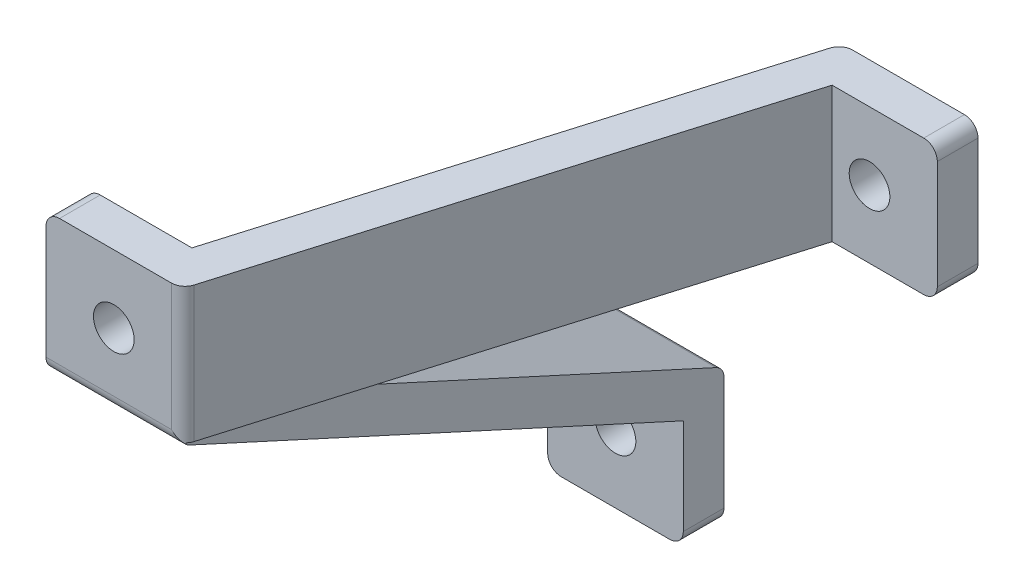
ISO-10303-21;
HEADER;
FILE_DESCRIPTION(('STEP AP214'),'2;1');
FILE_NAME('part.step','',(''),(''),'','','');
FILE_SCHEMA(('AUTOMOTIVE_DESIGN { 1 0 10303 214 1 1 1 1 }'));
ENDSEC;
DATA;
#1=APPLICATION_CONTEXT('core data for automotive mechanical design processes');
#2=APPLICATION_PROTOCOL_DEFINITION('international standard','automotive_design',2000,#1);
#3=PRODUCT_CONTEXT('',#1,'mechanical');
#4=PRODUCT('Part','Part','',(#3));
#5=PRODUCT_RELATED_PRODUCT_CATEGORY('part','',(#4));
#6=PRODUCT_DEFINITION_FORMATION('','',#4);
#7=PRODUCT_DEFINITION_CONTEXT('part definition',#1,'design');
#8=PRODUCT_DEFINITION('design','',#6,#7);
#9=PRODUCT_DEFINITION_SHAPE('','',#8);
#10=(LENGTH_UNIT() NAMED_UNIT(*) SI_UNIT(.MILLI.,.METRE.));
#11=(NAMED_UNIT(*) PLANE_ANGLE_UNIT() SI_UNIT($,.RADIAN.));
#12=(NAMED_UNIT(*) SI_UNIT($,.STERADIAN.) SOLID_ANGLE_UNIT());
#13=UNCERTAINTY_MEASURE_WITH_UNIT(LENGTH_MEASURE(1.E-05),#10,'distance_accuracy_value','');
#14=(GEOMETRIC_REPRESENTATION_CONTEXT(3) GLOBAL_UNCERTAINTY_ASSIGNED_CONTEXT((#13)) GLOBAL_UNIT_ASSIGNED_CONTEXT((#10,
#11,#12)) REPRESENTATION_CONTEXT('',''));
#15=CARTESIAN_POINT('',(0.,0.,0.));
#16=DIRECTION('',(0.,0.,1.));
#17=DIRECTION('',(1.,0.,0.));
#18=AXIS2_PLACEMENT_3D('',#15,#16,#17);
#19=CARTESIAN_POINT('',(-109.281112265453,-13.7331029199973,3.));
#20=DIRECTION('',(0.,-1.,0.));
#21=DIRECTION('',(-1.,0.,0.));
#22=AXIS2_PLACEMENT_3D('',#19,#20,#21);
#23=PLANE('',#22);
#24=DIRECTION('',(1.,0.,0.));
#25=VECTOR('',#24,1.);
#26=CARTESIAN_POINT('',(-109.281112265453,-13.7331029199973,0.));
#27=LINE('',#26,#25);
#28=CARTESIAN_POINT('',(-35.1593378215953,-13.7331029199973,0.));
#29=VERTEX_POINT('',#28);
#30=CARTESIAN_POINT('',(-26.9057977687508,-13.7331029199973,0.));
#31=VERTEX_POINT('',#30);
#32=EDGE_CURVE('E340',#29,#31,#27,.T.);
#33=ORIENTED_EDGE('',*,*,#32,.T.);
#34=DIRECTION('',(0.,0.,-1.));
#35=VECTOR('',#34,1.);
#36=CARTESIAN_POINT('',(-26.9057977687508,-13.7331029199973,3.));
#37=LINE('',#36,#35);
#38=CARTESIAN_POINT('',(-26.9057977687508,-13.7331029199973,3.));
#39=VERTEX_POINT('',#38);
#40=EDGE_CURVE('E355',#39,#31,#37,.T.);
#41=ORIENTED_EDGE('',*,*,#40,.F.);
#42=DIRECTION('',(1.,0.,0.));
#43=VECTOR('',#42,1.);
#44=CARTESIAN_POINT('',(-109.281112265453,-13.7331029199973,3.));
#45=LINE('',#44,#43);
#46=CARTESIAN_POINT('',(-33.6664179272841,-13.7331029199973,3.));
#47=VERTEX_POINT('',#46);
#48=EDGE_CURVE('E325',#47,#39,#45,.T.);
#49=ORIENTED_EDGE('',*,*,#48,.F.);
#50=DIRECTION('',(0.284354514419535,0.,-0.958719202962593));
#51=VECTOR('',#50,1.);
#52=CARTESIAN_POINT('',(-38.9625839085446,-13.7331029199973,20.8563580700542));
#53=LINE('',#52,#51);
#54=CARTESIAN_POINT('',(-44.4282968769192,-13.7331029199973,39.2843545144195));
#55=VERTEX_POINT('',#54);
#56=EDGE_CURVE('E302',#55,#47,#53,.T.);
#57=ORIENTED_EDGE('',*,*,#56,.F.);
#58=CARTESIAN_POINT('',(-45.3870160798818,-13.7331029199973,39.));
#59=DIRECTION('',(0.,1.,0.));
#60=DIRECTION('',(-1.,0.,0.));
#61=AXIS2_PLACEMENT_3D('',#58,#59,#60);
#62=CIRCLE('',#61,1.);
#63=CARTESIAN_POINT('',(-44.6405561327263,-13.7331029199973,39.6654303474388));
#64=VERTEX_POINT('',#63);
#65=EDGE_CURVE('E359',#64,#55,#62,.T.);
#66=ORIENTED_EDGE('',*,*,#65,.F.);
#67=DIRECTION('',(0.,0.,1.));
#68=VECTOR('',#67,1.);
#69=CARTESIAN_POINT('',(-44.6405561327263,-13.7331029199973,0.));
#70=LINE('',#69,#68);
#71=CARTESIAN_POINT('',(-44.6405561327263,-13.7331029199973,32.7886351030573));
#72=VERTEX_POINT('',#71);
#73=EDGE_CURVE('E306',#72,#64,#70,.T.);
#74=ORIENTED_EDGE('',*,*,#73,.F.);
#75=DIRECTION('',(1.,0.,0.));
#76=VECTOR('',#75,1.);
#77=CARTESIAN_POINT('',(-109.281112265452,-13.7331029199973,32.7886351030575));
#78=LINE('',#77,#76);
#79=CARTESIAN_POINT('',(-46.5505225814085,-13.7331029199973,32.7886351030573));
#80=VERTEX_POINT('',#79);
#81=EDGE_CURVE('E271',#80,#72,#78,.T.);
#82=ORIENTED_EDGE('',*,*,#81,.F.);
#83=CARTESIAN_POINT('',(-45.960950861435,-13.7331029199973,30.3848468040764));
#84=DIRECTION('',(0.,1.,0.));
#85=DIRECTION('',(0.284354514419536,0.,-0.958719202962593));
#86=AXIS2_PLACEMENT_3D('',#83,#84,#85);
#87=ELLIPSE('',#86,2.48968652663901,1.);
#88=CARTESIAN_POINT('',(-45.0022316584724,-13.7331029199973,30.6692013184959));
#89=VERTEX_POINT('',#88);
#90=EDGE_CURVE('E11',#89,#80,#87,.F.);
#91=ORIENTED_EDGE('',*,*,#90,.F.);
#92=DIRECTION('',(-0.284354514419535,0.,0.958719202962593));
#93=VECTOR('',#92,1.);
#94=CARTESIAN_POINT('',(-41.8387415174324,-13.7331029199973,20.0032945267956));
#95=LINE('',#94,#93);
#96=CARTESIAN_POINT('',(-36.1180570245578,-13.7331029199973,0.715645485580462));
#97=VERTEX_POINT('',#96);
#98=EDGE_CURVE('E297',#97,#89,#95,.T.);
#99=ORIENTED_EDGE('',*,*,#98,.F.);
#100=CARTESIAN_POINT('',(-35.1593378215953,-13.7331029199973,1.));
#101=DIRECTION('',(0.,1.,0.));
#102=DIRECTION('',(-1.,0.,0.));
#103=AXIS2_PLACEMENT_3D('',#100,#101,#102);
#104=CIRCLE('',#103,1.);
#105=EDGE_CURVE('E363',#29,#97,#104,.T.);
#106=ORIENTED_EDGE('',*,*,#105,.F.);
#107=EDGE_LOOP('',(#33,#41,#49,#57,#66,#74,#82,#91,#99,#106));
#108=FACE_BOUND('',#107,.T.);
#109=ADVANCED_FACE('F49',(#108),#23,.T.);
#110=CARTESIAN_POINT('',(-41.8387415174323,-55.8590694866648,20.0032945267957));
#111=DIRECTION('',(0.958719202962593,0.,0.284354514419535));
#112=DIRECTION('',(-0.284354514419535,0.,0.958719202962593));
#113=AXIS2_PLACEMENT_3D('',#110,#111,#112);
#114=PLANE('',#113);
#115=ORIENTED_EDGE('',*,*,#98,.T.);
#116=DIRECTION('',(-0.260409073095521,0.401656991472723,0.877985635332727));
#117=VECTOR('',#116,1.);
#118=CARTESIAN_POINT('',(-45.5294378749046,-12.9199359275393,32.4467103713997));
#119=LINE('',#118,#117);
#120=CARTESIAN_POINT('',(-46.8799359741929,-10.8369170945097,37.));
#121=VERTEX_POINT('',#120);
#122=EDGE_CURVE('E367',#121,#89,#119,.F.);
#123=ORIENTED_EDGE('',*,*,#122,.F.);
#124=DIRECTION('',(0.,1.,0.));
#125=VECTOR('',#124,1.);
#126=CARTESIAN_POINT('',(-46.8799359741928,-55.8590694866648,37.));
#127=LINE('',#126,#125);
#128=CARTESIAN_POINT('',(-46.8799359741929,-3.73310291999734,37.));
#129=VERTEX_POINT('',#128);
#130=EDGE_CURVE('E296',#121,#129,#127,.T.);
#131=ORIENTED_EDGE('',*,*,#130,.T.);
#132=DIRECTION('',(-0.284354514419535,0.,0.958719202962593));
#133=VECTOR('',#132,1.);
#134=CARTESIAN_POINT('',(-41.8387415174324,-3.73310291999733,20.0032945267957));
#135=LINE('',#134,#133);
#136=CARTESIAN_POINT('',(-36.1180570245578,-3.73310291999731,0.715645485580462));
#137=VERTEX_POINT('',#136);
#138=EDGE_CURVE('E292',#137,#129,#135,.T.);
#139=ORIENTED_EDGE('',*,*,#138,.F.);
#140=DIRECTION('',(0.,-1.,0.));
#141=VECTOR('',#140,1.);
#142=CARTESIAN_POINT('',(-36.1180570245577,-55.8590694866647,0.715645485580462));
#143=LINE('',#142,#141);
#144=EDGE_CURVE('E370',#97,#137,#143,.F.);
#145=ORIENTED_EDGE('',*,*,#144,.F.);
#146=EDGE_LOOP('',(#115,#123,#131,#139,#145));
#147=FACE_BOUND('',#146,.T.);
#148=ADVANCED_FACE('F506',(#147),#114,.F.);
#149=CARTESIAN_POINT('',(-109.281112265453,0.,3.));
#150=DIRECTION('',(0.,0.,1.));
#151=DIRECTION('',(-1.,0.,0.));
#152=AXIS2_PLACEMENT_3D('',#149,#150,#151);
#153=PLANE('',#152);
#154=CARTESIAN_POINT('',(-30.9057977687508,-8.73310291999731,3.));
#155=DIRECTION('',(0.,0.,-1.));
#156=DIRECTION('',(-1.,0.,0.));
#157=AXIS2_PLACEMENT_3D('',#154,#155,#156);
#158=CIRCLE('',#157,1.5);
#159=CARTESIAN_POINT('',(-32.4057977687508,-8.73310291999731,3.));
#160=VERTEX_POINT('',#159);
#161=EDGE_CURVE('E316',#160,#160,#158,.T.);
#162=ORIENTED_EDGE('',*,*,#161,.T.);
#163=EDGE_LOOP('',(#162));
#164=FACE_BOUND('',#163,.T.);
#165=DIRECTION('',(-1.,0.,0.));
#166=VECTOR('',#165,1.);
#167=CARTESIAN_POINT('',(-109.281112265453,-3.73310291999749,3.));
#168=LINE('',#167,#166);
#169=CARTESIAN_POINT('',(-26.9057977687508,-3.73310291999729,3.));
#170=VERTEX_POINT('',#169);
#171=CARTESIAN_POINT('',(-33.6664179272842,-3.73310291999731,3.));
#172=VERTEX_POINT('',#171);
#173=EDGE_CURVE('E329',#170,#172,#168,.T.);
#174=ORIENTED_EDGE('',*,*,#173,.T.);
#175=DIRECTION('',(0.,1.,0.));
#176=VECTOR('',#175,1.);
#177=CARTESIAN_POINT('',(-33.666417927284,-55.8590694866647,3.));
#178=LINE('',#177,#176);
#179=EDGE_CURVE('E291',#47,#172,#178,.T.);
#180=ORIENTED_EDGE('',*,*,#179,.F.);
#181=ORIENTED_EDGE('',*,*,#48,.T.);
#182=CARTESIAN_POINT('',(-26.9057977687508,-12.7331029199973,3.));
#183=DIRECTION('',(0.,0.,-1.));
#184=DIRECTION('',(-1.,0.,0.));
#185=AXIS2_PLACEMENT_3D('',#182,#183,#184);
#186=CIRCLE('',#185,1.);
#187=CARTESIAN_POINT('',(-25.9057977687508,-12.7331029199973,3.));
#188=VERTEX_POINT('',#187);
#189=EDGE_CURVE('E470',#188,#39,#186,.T.);
#190=ORIENTED_EDGE('',*,*,#189,.F.);
#191=DIRECTION('',(0.,1.,0.));
#192=VECTOR('',#191,1.);
#193=CARTESIAN_POINT('',(-25.9057977687508,0.,3.));
#194=LINE('',#193,#192);
#195=CARTESIAN_POINT('',(-25.9057977687508,-4.73310291999729,3.));
#196=VERTEX_POINT('',#195);
#197=EDGE_CURVE('E320',#188,#196,#194,.T.);
#198=ORIENTED_EDGE('',*,*,#197,.T.);
#199=CARTESIAN_POINT('',(-26.9057977687508,-4.73310291999729,3.));
#200=DIRECTION('',(0.,0.,-1.));
#201=DIRECTION('',(-1.,0.,0.));
#202=AXIS2_PLACEMENT_3D('',#199,#200,#201);
#203=CIRCLE('',#202,1.);
#204=EDGE_CURVE('E59',#170,#196,#203,.T.);
#205=ORIENTED_EDGE('',*,*,#204,.F.);
#206=EDGE_LOOP('',(#174,#180,#181,#190,#198,#205));
#207=FACE_BOUND('',#206,.T.);
#208=ADVANCED_FACE('F481',(#164,#207),#153,.T.);
#209=CARTESIAN_POINT('',(-25.9057977687508,0.,3.));
#210=DIRECTION('',(1.,0.,0.));
#211=DIRECTION('',(0.,0.,1.));
#212=AXIS2_PLACEMENT_3D('',#209,#210,#211);
#213=PLANE('',#212);
#214=ORIENTED_EDGE('',*,*,#197,.F.);
#215=DIRECTION('',(0.,0.,-1.));
#216=VECTOR('',#215,1.);
#217=CARTESIAN_POINT('',(-25.9057977687508,-12.7331029199973,3.));
#218=LINE('',#217,#216);
#219=CARTESIAN_POINT('',(-25.9057977687508,-12.7331029199973,0.));
#220=VERTEX_POINT('',#219);
#221=EDGE_CURVE('E74',#220,#188,#218,.F.);
#222=ORIENTED_EDGE('',*,*,#221,.F.);
#223=DIRECTION('',(0.,1.,0.));
#224=VECTOR('',#223,1.);
#225=CARTESIAN_POINT('',(-25.9057977687508,0.,0.));
#226=LINE('',#225,#224);
#227=CARTESIAN_POINT('',(-25.9057977687508,-4.73310291999729,0.));
#228=VERTEX_POINT('',#227);
#229=EDGE_CURVE('E337',#220,#228,#226,.T.);
#230=ORIENTED_EDGE('',*,*,#229,.T.);
#231=DIRECTION('',(0.,0.,-1.));
#232=VECTOR('',#231,1.);
#233=CARTESIAN_POINT('',(-25.9057977687508,-4.73310291999729,3.));
#234=LINE('',#233,#232);
#235=EDGE_CURVE('E66',#196,#228,#234,.T.);
#236=ORIENTED_EDGE('',*,*,#235,.F.);
#237=EDGE_LOOP('',(#214,#222,#230,#236));
#238=FACE_BOUND('',#237,.T.);
#239=ADVANCED_FACE('F482',(#238),#213,.T.);
#240=CARTESIAN_POINT('',(-30.9057977687508,-8.73310291999731,3.));
#241=DIRECTION('',(0.,0.,-1.));
#242=DIRECTION('',(1.,0.,0.));
#243=AXIS2_PLACEMENT_3D('',#240,#241,#242);
#244=CYLINDRICAL_SURFACE('',#243,1.5);
#245=ORIENTED_EDGE('',*,*,#161,.F.);
#246=EDGE_LOOP('',(#245));
#247=FACE_BOUND('',#246,.T.);
#248=CARTESIAN_POINT('',(-30.9057977687508,-8.73310291999731,0.));
#249=DIRECTION('',(0.,0.,-1.));
#250=DIRECTION('',(-1.,0.,0.));
#251=AXIS2_PLACEMENT_3D('',#248,#249,#250);
#252=CIRCLE('',#251,1.5);
#253=CARTESIAN_POINT('',(-32.4057977687508,-8.73310291999731,0.));
#254=VERTEX_POINT('',#253);
#255=EDGE_CURVE('E301',#254,#254,#252,.T.);
#256=ORIENTED_EDGE('',*,*,#255,.T.);
#257=EDGE_LOOP('',(#256));
#258=FACE_BOUND('',#257,.T.);
#259=ADVANCED_FACE('F518',(#247,#258),#244,.F.);
#260=CARTESIAN_POINT('',(-109.281112265453,-3.73310291999749,3.));
#261=DIRECTION('',(0.,1.,0.));
#262=DIRECTION('',(1.,0.,0.));
#263=AXIS2_PLACEMENT_3D('',#260,#261,#262);
#264=PLANE('',#263);
#265=ORIENTED_EDGE('',*,*,#138,.T.);
#266=DIRECTION('',(1.,0.,0.));
#267=VECTOR('',#266,1.);
#268=CARTESIAN_POINT('',(-109.281112265453,-3.73310291999731,37.));
#269=LINE('',#268,#267);
#270=CARTESIAN_POINT('',(-53.6405561327263,-3.73310291999731,37.));
#271=VERTEX_POINT('',#270);
#272=EDGE_CURVE('E237',#271,#129,#269,.T.);
#273=ORIENTED_EDGE('',*,*,#272,.F.);
#274=DIRECTION('',(0.,0.,-1.));
#275=VECTOR('',#274,1.);
#276=CARTESIAN_POINT('',(-53.6405561327263,-3.73310291999736,3.));
#277=LINE('',#276,#275);
#278=CARTESIAN_POINT('',(-53.6405561327263,-3.73310291999731,40.));
#279=VERTEX_POINT('',#278);
#280=EDGE_CURVE('E377',#279,#271,#277,.T.);
#281=ORIENTED_EDGE('',*,*,#280,.F.);
#282=DIRECTION('',(1.,0.,0.));
#283=VECTOR('',#282,1.);
#284=CARTESIAN_POINT('',(-109.281112265453,-3.73310291999731,40.));
#285=LINE('',#284,#283);
#286=CARTESIAN_POINT('',(-45.3870160798818,-3.73310291999731,40.));
#287=VERTEX_POINT('',#286);
#288=EDGE_CURVE('E561',#279,#287,#285,.T.);
#289=ORIENTED_EDGE('',*,*,#288,.T.);
#290=CARTESIAN_POINT('',(-45.3870160798818,-3.73310291999734,39.));
#291=DIRECTION('',(0.,-1.,0.));
#292=DIRECTION('',(1.,0.,0.));
#293=AXIS2_PLACEMENT_3D('',#290,#291,#292);
#294=CIRCLE('',#293,1.);
#295=CARTESIAN_POINT('',(-44.4282968769192,-3.73310291999733,39.2843545144195));
#296=VERTEX_POINT('',#295);
#297=EDGE_CURVE('E381',#296,#287,#294,.T.);
#298=ORIENTED_EDGE('',*,*,#297,.F.);
#299=DIRECTION('',(0.284354514419535,0.,-0.958719202962593));
#300=VECTOR('',#299,1.);
#301=CARTESIAN_POINT('',(-38.9625839085446,-3.73310291999732,20.8563580700543));
#302=LINE('',#301,#300);
#303=EDGE_CURVE('E288',#296,#172,#302,.T.);
#304=ORIENTED_EDGE('',*,*,#303,.T.);
#305=ORIENTED_EDGE('',*,*,#173,.F.);
#306=DIRECTION('',(0.,0.,-1.));
#307=VECTOR('',#306,1.);
#308=CARTESIAN_POINT('',(-26.9057977687508,-3.73310291999729,3.));
#309=LINE('',#308,#307);
#310=CARTESIAN_POINT('',(-26.9057977687508,-3.73310291999729,0.));
#311=VERTEX_POINT('',#310);
#312=EDGE_CURVE('E374',#311,#170,#309,.F.);
#313=ORIENTED_EDGE('',*,*,#312,.F.);
#314=DIRECTION('',(-1.,0.,0.));
#315=VECTOR('',#314,1.);
#316=CARTESIAN_POINT('',(-109.281112265453,-3.73310291999749,0.));
#317=LINE('',#316,#315);
#318=CARTESIAN_POINT('',(-35.1593378215953,-3.73310291999731,0.));
#319=VERTEX_POINT('',#318);
#320=EDGE_CURVE('E321',#311,#319,#317,.T.);
#321=ORIENTED_EDGE('',*,*,#320,.T.);
#322=CARTESIAN_POINT('',(-35.1593378215953,-3.73310291999731,1.));
#323=DIRECTION('',(0.,-1.,0.));
#324=DIRECTION('',(1.,0.,0.));
#325=AXIS2_PLACEMENT_3D('',#322,#323,#324);
#326=CIRCLE('',#325,1.);
#327=EDGE_CURVE('E385',#137,#319,#326,.T.);
#328=ORIENTED_EDGE('',*,*,#327,.F.);
#329=EDGE_LOOP('',(#265,#273,#281,#289,#298,#304,#305,#313,#321,#328));
#330=FACE_BOUND('',#329,.T.);
#331=ADVANCED_FACE('F489',(#330),#264,.T.);
#332=CARTESIAN_POINT('',(-109.281112265453,0.,0.));
#333=DIRECTION('',(0.,0.,1.));
#334=DIRECTION('',(-1.,0.,0.));
#335=AXIS2_PLACEMENT_3D('',#332,#333,#334);
#336=PLANE('',#335);
#337=ORIENTED_EDGE('',*,*,#255,.F.);
#338=EDGE_LOOP('',(#337));
#339=FACE_BOUND('',#338,.T.);
#340=ORIENTED_EDGE('',*,*,#320,.F.);
#341=CARTESIAN_POINT('',(-26.9057977687508,-4.73310291999729,0.));
#342=DIRECTION('',(0.,0.,-1.));
#343=DIRECTION('',(-1.,0.,0.));
#344=AXIS2_PLACEMENT_3D('',#341,#342,#343);
#345=CIRCLE('',#344,1.);
#346=EDGE_CURVE('E349',#228,#311,#345,.F.);
#347=ORIENTED_EDGE('',*,*,#346,.F.);
#348=ORIENTED_EDGE('',*,*,#229,.F.);
#349=CARTESIAN_POINT('',(-26.9057977687508,-12.7331029199973,0.));
#350=DIRECTION('',(0.,0.,-1.));
#351=DIRECTION('',(-1.,0.,0.));
#352=AXIS2_PLACEMENT_3D('',#349,#350,#351);
#353=CIRCLE('',#352,1.);
#354=EDGE_CURVE('E333',#31,#220,#353,.F.);
#355=ORIENTED_EDGE('',*,*,#354,.F.);
#356=ORIENTED_EDGE('',*,*,#32,.F.);
#357=DIRECTION('',(0.,-1.,0.));
#358=VECTOR('',#357,1.);
#359=CARTESIAN_POINT('',(-35.1593378215953,1.83227614647563E-13,0.));
#360=LINE('',#359,#358);
#361=EDGE_CURVE('E352',#319,#29,#360,.T.);
#362=ORIENTED_EDGE('',*,*,#361,.F.);
#363=EDGE_LOOP('',(#340,#347,#348,#355,#356,#362));
#364=FACE_BOUND('',#363,.T.);
#365=ADVANCED_FACE('F486',(#339,#364),#336,.F.);
#366=CARTESIAN_POINT('',(-38.9625839085445,-55.8590694866647,20.8563580700543));
#367=DIRECTION('',(-0.958719202962593,0.,-0.284354514419535));
#368=DIRECTION('',(0.284354514419535,0.,-0.958719202962593));
#369=AXIS2_PLACEMENT_3D('',#366,#367,#368);
#370=PLANE('',#369);
#371=ORIENTED_EDGE('',*,*,#56,.T.);
#372=ORIENTED_EDGE('',*,*,#179,.T.);
#373=ORIENTED_EDGE('',*,*,#303,.F.);
#374=DIRECTION('',(0.,1.,0.));
#375=VECTOR('',#374,1.);
#376=CARTESIAN_POINT('',(-44.4282968769192,-3.73310291999733,39.2843545144195));
#377=LINE('',#376,#375);
#378=EDGE_CURVE('E435',#55,#296,#377,.T.);
#379=ORIENTED_EDGE('',*,*,#378,.F.);
#380=EDGE_LOOP('',(#371,#372,#373,#379));
#381=FACE_BOUND('',#380,.T.);
#382=ADVANCED_FACE('F496',(#381),#370,.F.);
#383=CARTESIAN_POINT('',(-109.281112265453,0.,37.));
#384=DIRECTION('',(0.,0.,1.));
#385=DIRECTION('',(-1.,0.,0.));
#386=AXIS2_PLACEMENT_3D('',#383,#384,#385);
#387=PLANE('',#386);
#388=CARTESIAN_POINT('',(-49.6405561327263,-8.73310291999731,37.));
#389=DIRECTION('',(0.,0.,-1.));
#390=DIRECTION('',(-1.,0.,0.));
#391=AXIS2_PLACEMENT_3D('',#388,#389,#390);
#392=CIRCLE('',#391,1.5);
#393=CARTESIAN_POINT('',(-51.1405561327263,-8.73310291999731,37.));
#394=VERTEX_POINT('',#393);
#395=EDGE_CURVE('E238',#394,#394,#392,.T.);
#396=ORIENTED_EDGE('',*,*,#395,.F.);
#397=EDGE_LOOP('',(#396));
#398=FACE_BOUND('',#397,.T.);
#399=DIRECTION('',(1.,0.,0.));
#400=VECTOR('',#399,1.);
#401=CARTESIAN_POINT('',(-98.8609461704927,-11.8065063033468,37.));
#402=LINE('',#401,#400);
#403=CARTESIAN_POINT('',(-54.6405561327263,-11.8065063033467,37.));
#404=VERTEX_POINT('',#403);
#405=CARTESIAN_POINT('',(-47.7996063763435,-11.8065063033467,37.));
#406=VERTEX_POINT('',#405);
#407=EDGE_CURVE('E217',#404,#406,#402,.T.);
#408=ORIENTED_EDGE('',*,*,#407,.F.);
#409=DIRECTION('',(0.,1.,0.));
#410=VECTOR('',#409,1.);
#411=CARTESIAN_POINT('',(-54.6405561327263,0.,37.));
#412=LINE('',#411,#410);
#413=CARTESIAN_POINT('',(-54.6405561327263,-4.73310291999736,37.));
#414=VERTEX_POINT('',#413);
#415=EDGE_CURVE('E228',#404,#414,#412,.T.);
#416=ORIENTED_EDGE('',*,*,#415,.T.);
#417=CARTESIAN_POINT('',(-53.6405561327263,-4.73310291999736,37.));
#418=DIRECTION('',(0.,0.,-1.));
#419=DIRECTION('',(-1.,0.,0.));
#420=AXIS2_PLACEMENT_3D('',#417,#418,#419);
#421=CIRCLE('',#420,1.);
#422=EDGE_CURVE('E430',#271,#414,#421,.F.);
#423=ORIENTED_EDGE('',*,*,#422,.F.);
#424=ORIENTED_EDGE('',*,*,#272,.T.);
#425=ORIENTED_EDGE('',*,*,#130,.F.);
#426=CARTESIAN_POINT('',(-47.9229942512253,-10.7068318468961,37.));
#427=DIRECTION('',(0.,0.,-1.));
#428=DIRECTION('',(0.544007011591262,-0.839080670340787,0.));
#429=AXIS2_PLACEMENT_3D('',#426,#427,#428);
#430=ELLIPSE('',#429,1.1389707983332,1.);
#431=EDGE_CURVE('E243',#406,#121,#430,.F.);
#432=ORIENTED_EDGE('',*,*,#431,.F.);
#433=EDGE_LOOP('',(#408,#416,#423,#424,#425,#432));
#434=FACE_BOUND('',#433,.T.);
#435=ADVANCED_FACE('F241',(#398,#434),#387,.F.);
#436=CARTESIAN_POINT('',(-109.281112265453,0.,3.));
#437=DIRECTION('',(0.,0.,1.));
#438=DIRECTION('',(-1.,0.,0.));
#439=AXIS2_PLACEMENT_3D('',#436,#437,#438);
#440=PLANE('',#439);
#441=CARTESIAN_POINT('',(-49.6405561327263,-33.7331029199973,3.));
#442=DIRECTION('',(0.,0.,-1.));
#443=DIRECTION('',(-1.,0.,0.));
#444=AXIS2_PLACEMENT_3D('',#441,#442,#443);
#445=CIRCLE('',#444,1.5);
#446=CARTESIAN_POINT('',(-51.1405561327263,-33.7331029199973,3.));
#447=VERTEX_POINT('',#446);
#448=EDGE_CURVE('E254',#447,#447,#445,.T.);
#449=ORIENTED_EDGE('',*,*,#448,.T.);
#450=EDGE_LOOP('',(#449));
#451=FACE_BOUND('',#450,.T.);
#452=DIRECTION('',(0.,-1.,0.));
#453=VECTOR('',#452,1.);
#454=CARTESIAN_POINT('',(-44.6405561327263,0.,3.));
#455=LINE('',#454,#453);
#456=CARTESIAN_POINT('',(-44.6405561327263,-30.6596995366479,3.));
#457=VERTEX_POINT('',#456);
#458=CARTESIAN_POINT('',(-44.6405561327263,-37.7331029199973,3.));
#459=VERTEX_POINT('',#458);
#460=EDGE_CURVE('E263',#457,#459,#455,.T.);
#461=ORIENTED_EDGE('',*,*,#460,.F.);
#462=DIRECTION('',(1.,0.,0.));
#463=VECTOR('',#462,1.);
#464=CARTESIAN_POINT('',(-98.8609461704927,-30.659699536648,3.));
#465=LINE('',#464,#463);
#466=CARTESIAN_POINT('',(-54.6405561327263,-30.6596995366479,3.));
#467=VERTEX_POINT('',#466);
#468=EDGE_CURVE('E250',#467,#457,#465,.T.);
#469=ORIENTED_EDGE('',*,*,#468,.F.);
#470=DIRECTION('',(0.,-1.,0.));
#471=VECTOR('',#470,1.);
#472=CARTESIAN_POINT('',(-54.6405561327263,0.,3.));
#473=LINE('',#472,#471);
#474=CARTESIAN_POINT('',(-54.6405561327263,-37.7331029199973,3.));
#475=VERTEX_POINT('',#474);
#476=EDGE_CURVE('E258',#467,#475,#473,.T.);
#477=ORIENTED_EDGE('',*,*,#476,.T.);
#478=CARTESIAN_POINT('',(-53.6405561327263,-37.7331029199973,3.));
#479=DIRECTION('',(0.,0.,-1.));
#480=DIRECTION('',(-1.,0.,0.));
#481=AXIS2_PLACEMENT_3D('',#478,#479,#480);
#482=CIRCLE('',#481,1.);
#483=CARTESIAN_POINT('',(-53.6405561327263,-38.7331029199973,3.));
#484=VERTEX_POINT('',#483);
#485=EDGE_CURVE('E458',#484,#475,#482,.T.);
#486=ORIENTED_EDGE('',*,*,#485,.F.);
#487=DIRECTION('',(-1.,0.,0.));
#488=VECTOR('',#487,1.);
#489=CARTESIAN_POINT('',(-109.281112265453,-38.7331029199973,3.));
#490=LINE('',#489,#488);
#491=CARTESIAN_POINT('',(-45.6405561327263,-38.7331029199973,3.));
#492=VERTEX_POINT('',#491);
#493=EDGE_CURVE('E267',#492,#484,#490,.T.);
#494=ORIENTED_EDGE('',*,*,#493,.F.);
#495=CARTESIAN_POINT('',(-45.6405561327263,-37.7331029199973,3.));
#496=DIRECTION('',(0.,0.,-1.));
#497=DIRECTION('',(-1.,0.,0.));
#498=AXIS2_PLACEMENT_3D('',#495,#496,#497);
#499=CIRCLE('',#498,1.);
#500=EDGE_CURVE('E462',#459,#492,#499,.T.);
#501=ORIENTED_EDGE('',*,*,#500,.F.);
#502=EDGE_LOOP('',(#461,#469,#477,#486,#494,#501));
#503=FACE_BOUND('',#502,.T.);
#504=ADVANCED_FACE('F590',(#451,#503),#440,.T.);
#505=CARTESIAN_POINT('',(-54.6405561327263,0.,3.));
#506=DIRECTION('',(-1.,0.,0.));
#507=DIRECTION('',(0.,0.,-1.));
#508=AXIS2_PLACEMENT_3D('',#505,#506,#507);
#509=PLANE('',#508);
#510=DIRECTION('',(0.,-1.,0.));
#511=VECTOR('',#510,1.);
#512=CARTESIAN_POINT('',(-54.6405561327263,0.,0.));
#513=LINE('',#512,#511);
#514=CARTESIAN_POINT('',(-54.6405561327263,-29.3753017922142,0.));
#515=VERTEX_POINT('',#514);
#516=CARTESIAN_POINT('',(-54.6405561327263,-37.7331029199973,0.));
#517=VERTEX_POINT('',#516);
#518=EDGE_CURVE('E275',#515,#517,#513,.T.);
#519=ORIENTED_EDGE('',*,*,#518,.T.);
#520=DIRECTION('',(0.,0.,-1.));
#521=VECTOR('',#520,1.);
#522=CARTESIAN_POINT('',(-54.6405561327263,-37.7331029199973,0.));
#523=LINE('',#522,#521);
#524=EDGE_CURVE('E400',#475,#517,#523,.T.);
#525=ORIENTED_EDGE('',*,*,#524,.F.);
#526=ORIENTED_EDGE('',*,*,#476,.F.);
#527=DIRECTION('',(0.,-0.416010012372535,-0.909360032993425));
#528=VECTOR('',#527,1.);
#529=CARTESIAN_POINT('',(-54.6405561327263,-26.4885078019807,12.1178455821927));
#530=LINE('',#529,#528);
#531=CARTESIAN_POINT('',(-54.6405561327263,-14.0002640807739,39.4160100123725));
#532=VERTEX_POINT('',#531);
#533=EDGE_CURVE('E225',#532,#467,#530,.T.);
#534=ORIENTED_EDGE('',*,*,#533,.F.);
#535=CARTESIAN_POINT('',(-54.6405561327263,-13.0909040477804,39.));
#536=DIRECTION('',(1.,0.,0.));
#537=DIRECTION('',(0.,0.,-1.));
#538=AXIS2_PLACEMENT_3D('',#535,#536,#537);
#539=CIRCLE('',#538,1.);
#540=CARTESIAN_POINT('',(-54.6405561327263,-13.0909040477804,40.));
#541=VERTEX_POINT('',#540);
#542=EDGE_CURVE('E404',#541,#532,#539,.T.);
#543=ORIENTED_EDGE('',*,*,#542,.F.);
#544=DIRECTION('',(0.,1.,0.));
#545=VECTOR('',#544,1.);
#546=CARTESIAN_POINT('',(-54.6405561327263,0.,40.));
#547=LINE('',#546,#545);
#548=CARTESIAN_POINT('',(-54.6405561327263,-4.73310291999736,40.));
#549=VERTEX_POINT('',#548);
#550=EDGE_CURVE('E565',#541,#549,#547,.T.);
#551=ORIENTED_EDGE('',*,*,#550,.T.);
#552=DIRECTION('',(0.,0.,-1.));
#553=VECTOR('',#552,1.);
#554=CARTESIAN_POINT('',(-54.6405561327263,-4.73310291999736,3.));
#555=LINE('',#554,#553);
#556=EDGE_CURVE('E233',#414,#549,#555,.F.);
#557=ORIENTED_EDGE('',*,*,#556,.F.);
#558=ORIENTED_EDGE('',*,*,#415,.F.);
#559=DIRECTION('',(0.,0.416010012372535,0.909360032993425));
#560=VECTOR('',#559,1.);
#561=CARTESIAN_POINT('',(-54.6405561327263,-23.7604277030004,10.8698155450751));
#562=LINE('',#561,#560);
#563=CARTESIAN_POINT('',(-54.6405561327263,-28.4659417592208,0.583989987627462));
#564=VERTEX_POINT('',#563);
#565=EDGE_CURVE('E213',#564,#404,#562,.T.);
#566=ORIENTED_EDGE('',*,*,#565,.F.);
#567=CARTESIAN_POINT('',(-54.6405561327263,-29.3753017922142,1.));
#568=DIRECTION('',(1.,0.,0.));
#569=DIRECTION('',(0.,0.,-1.));
#570=AXIS2_PLACEMENT_3D('',#567,#568,#569);
#571=CIRCLE('',#570,1.);
#572=EDGE_CURVE('E408',#515,#564,#571,.T.);
#573=ORIENTED_EDGE('',*,*,#572,.F.);
#574=EDGE_LOOP('',(#519,#525,#526,#534,#543,#551,#557,#558,#566,#573));
#575=FACE_BOUND('',#574,.T.);
#576=ADVANCED_FACE('F230',(#575),#509,.T.);
#577=CARTESIAN_POINT('',(-44.6405561327263,0.,3.));
#578=DIRECTION('',(-1.,0.,0.));
#579=DIRECTION('',(0.,1.,0.));
#580=AXIS2_PLACEMENT_3D('',#577,#578,#579);
#581=PLANE('',#580);
#582=DIRECTION('',(0.,0.416010012372535,0.909360032993425));
#583=VECTOR('',#582,1.);
#584=CARTESIAN_POINT('',(-44.6405561327263,-23.7604277030004,10.8698155450751));
#585=LINE('',#584,#583);
#586=CARTESIAN_POINT('',(-44.6405561327263,-28.4659417592208,0.583989987627462));
#587=VERTEX_POINT('',#586);
#588=EDGE_CURVE('E245',#587,#72,#585,.T.);
#589=ORIENTED_EDGE('',*,*,#588,.T.);
#590=ORIENTED_EDGE('',*,*,#73,.T.);
#591=DIRECTION('',(0.,-1.,0.));
#592=VECTOR('',#591,1.);
#593=CARTESIAN_POINT('',(-44.6405561327263,-13.8861603672696,39.6654303474389));
#594=LINE('',#593,#592);
#595=CARTESIAN_POINT('',(-44.6405561327263,-13.8373639949359,39.6654303474389));
#596=VERTEX_POINT('',#595);
#597=EDGE_CURVE('E423',#596,#64,#594,.F.);
#598=ORIENTED_EDGE('',*,*,#597,.F.);
#599=CARTESIAN_POINT('',(-44.6405561327263,-13.0909040477804,39.));
#600=DIRECTION('',(1.,0.,0.));
#601=DIRECTION('',(0.,1.,0.));
#602=AXIS2_PLACEMENT_3D('',#599,#600,#601);
#603=CIRCLE('',#602,1.);
#604=CARTESIAN_POINT('',(-44.6405561327263,-14.0002640807738,39.4160100123725));
#605=VERTEX_POINT('',#604);
#606=EDGE_CURVE('E419',#605,#596,#603,.F.);
#607=ORIENTED_EDGE('',*,*,#606,.F.);
#608=DIRECTION('',(0.,-0.416010012372535,-0.909360032993425));
#609=VECTOR('',#608,1.);
#610=CARTESIAN_POINT('',(-44.6405561327263,-26.4885078019807,12.1178455821927));
#611=LINE('',#610,#609);
#612=EDGE_CURVE('E564',#605,#457,#611,.T.);
#613=ORIENTED_EDGE('',*,*,#612,.T.);
#614=ORIENTED_EDGE('',*,*,#460,.T.);
#615=DIRECTION('',(0.,0.,-1.));
#616=VECTOR('',#615,1.);
#617=CARTESIAN_POINT('',(-44.6405561327263,-37.7331029199973,3.));
#618=LINE('',#617,#616);
#619=CARTESIAN_POINT('',(-44.6405561327263,-37.7331029199973,0.));
#620=VERTEX_POINT('',#619);
#621=EDGE_CURVE('E416',#620,#459,#618,.F.);
#622=ORIENTED_EDGE('',*,*,#621,.F.);
#623=DIRECTION('',(0.,-1.,0.));
#624=VECTOR('',#623,1.);
#625=CARTESIAN_POINT('',(-44.6405561327263,0.,0.));
#626=LINE('',#625,#624);
#627=CARTESIAN_POINT('',(-44.6405561327263,-29.3753017922142,0.));
#628=VERTEX_POINT('',#627);
#629=EDGE_CURVE('E278',#628,#620,#626,.T.);
#630=ORIENTED_EDGE('',*,*,#629,.F.);
#631=CARTESIAN_POINT('',(-44.6405561327263,-29.3753017922142,1.));
#632=DIRECTION('',(1.,0.,0.));
#633=DIRECTION('',(0.,1.,0.));
#634=AXIS2_PLACEMENT_3D('',#631,#632,#633);
#635=CIRCLE('',#634,1.);
#636=EDGE_CURVE('E426',#587,#628,#635,.F.);
#637=ORIENTED_EDGE('',*,*,#636,.F.);
#638=EDGE_LOOP('',(#589,#590,#598,#607,#613,#614,#622,#630,#637));
#639=FACE_BOUND('',#638,.T.);
#640=ADVANCED_FACE('F593',(#639),#581,.F.);
#641=CARTESIAN_POINT('',(-49.6405561327263,-33.7331029199973,3.));
#642=DIRECTION('',(0.,0.,-1.));
#643=DIRECTION('',(1.,0.,0.));
#644=AXIS2_PLACEMENT_3D('',#641,#642,#643);
#645=CYLINDRICAL_SURFACE('',#644,1.5);
#646=ORIENTED_EDGE('',*,*,#448,.F.);
#647=EDGE_LOOP('',(#646));
#648=FACE_BOUND('',#647,.T.);
#649=CARTESIAN_POINT('',(-49.6405561327263,-33.7331029199973,0.));
#650=DIRECTION('',(0.,0.,-1.));
#651=DIRECTION('',(-1.,0.,0.));
#652=AXIS2_PLACEMENT_3D('',#649,#650,#651);
#653=CIRCLE('',#652,1.5);
#654=CARTESIAN_POINT('',(-51.1405561327263,-33.7331029199973,0.));
#655=VERTEX_POINT('',#654);
#656=EDGE_CURVE('E224',#655,#655,#653,.T.);
#657=ORIENTED_EDGE('',*,*,#656,.T.);
#658=EDGE_LOOP('',(#657));
#659=FACE_BOUND('',#658,.T.);
#660=ADVANCED_FACE('F611',(#648,#659),#645,.F.);
#661=CARTESIAN_POINT('',(-109.281112265453,-38.7331029199973,3.));
#662=DIRECTION('',(0.,1.,0.));
#663=DIRECTION('',(0.,0.,1.));
#664=AXIS2_PLACEMENT_3D('',#661,#662,#663);
#665=PLANE('',#664);
#666=ORIENTED_EDGE('',*,*,#493,.T.);
#667=DIRECTION('',(0.,0.,-1.));
#668=VECTOR('',#667,1.);
#669=CARTESIAN_POINT('',(-53.6405561327263,-38.7331029199973,3.));
#670=LINE('',#669,#668);
#671=CARTESIAN_POINT('',(-53.6405561327263,-38.7331029199973,0.));
#672=VERTEX_POINT('',#671);
#673=EDGE_CURVE('E451',#672,#484,#670,.F.);
#674=ORIENTED_EDGE('',*,*,#673,.F.);
#675=DIRECTION('',(-1.,0.,0.));
#676=VECTOR('',#675,1.);
#677=CARTESIAN_POINT('',(-109.281112265453,-38.7331029199973,0.));
#678=LINE('',#677,#676);
#679=CARTESIAN_POINT('',(-45.6405561327263,-38.7331029199973,0.));
#680=VERTEX_POINT('',#679);
#681=EDGE_CURVE('E259',#680,#672,#678,.T.);
#682=ORIENTED_EDGE('',*,*,#681,.F.);
#683=DIRECTION('',(0.,0.,-1.));
#684=VECTOR('',#683,1.);
#685=CARTESIAN_POINT('',(-45.6405561327263,-38.7331029199973,3.));
#686=LINE('',#685,#684);
#687=EDGE_CURVE('E454',#492,#680,#686,.T.);
#688=ORIENTED_EDGE('',*,*,#687,.F.);
#689=EDGE_LOOP('',(#666,#674,#682,#688));
#690=FACE_BOUND('',#689,.T.);
#691=ADVANCED_FACE('F609',(#690),#665,.F.);
#692=CARTESIAN_POINT('',(-109.281112265453,0.,0.));
#693=DIRECTION('',(0.,0.,1.));
#694=DIRECTION('',(-1.,0.,0.));
#695=AXIS2_PLACEMENT_3D('',#692,#693,#694);
#696=PLANE('',#695);
#697=ORIENTED_EDGE('',*,*,#656,.F.);
#698=EDGE_LOOP('',(#697));
#699=FACE_BOUND('',#698,.T.);
#700=ORIENTED_EDGE('',*,*,#629,.T.);
#701=CARTESIAN_POINT('',(-45.6405561327263,-37.7331029199973,0.));
#702=DIRECTION('',(0.,0.,-1.));
#703=DIRECTION('',(-1.,0.,0.));
#704=AXIS2_PLACEMENT_3D('',#701,#702,#703);
#705=CIRCLE('',#704,1.);
#706=EDGE_CURVE('E392',#680,#620,#705,.F.);
#707=ORIENTED_EDGE('',*,*,#706,.F.);
#708=ORIENTED_EDGE('',*,*,#681,.T.);
#709=CARTESIAN_POINT('',(-53.6405561327263,-37.7331029199973,0.));
#710=DIRECTION('',(0.,0.,-1.));
#711=DIRECTION('',(-1.,0.,0.));
#712=AXIS2_PLACEMENT_3D('',#709,#710,#711);
#713=CIRCLE('',#712,1.);
#714=EDGE_CURVE('E389',#517,#672,#713,.F.);
#715=ORIENTED_EDGE('',*,*,#714,.F.);
#716=ORIENTED_EDGE('',*,*,#518,.F.);
#717=DIRECTION('',(-1.,0.,0.));
#718=VECTOR('',#717,1.);
#719=CARTESIAN_POINT('',(-109.281112265452,-29.3753017922143,0.));
#720=LINE('',#719,#718);
#721=EDGE_CURVE('E395',#628,#515,#720,.T.);
#722=ORIENTED_EDGE('',*,*,#721,.F.);
#723=EDGE_LOOP('',(#700,#707,#708,#715,#716,#722));
#724=FACE_BOUND('',#723,.T.);
#725=ADVANCED_FACE('F598',(#699,#724),#696,.F.);
#726=CARTESIAN_POINT('',(-98.8609461704927,-26.4885078019808,12.1178455821927));
#727=DIRECTION('',(0.,0.909360032993425,-0.416010012372535));
#728=DIRECTION('',(0.,0.416010012372535,0.909360032993425));
#729=AXIS2_PLACEMENT_3D('',#726,#727,#728);
#730=PLANE('',#729);
#731=ORIENTED_EDGE('',*,*,#533,.T.);
#732=ORIENTED_EDGE('',*,*,#468,.T.);
#733=ORIENTED_EDGE('',*,*,#612,.F.);
#734=DIRECTION('',(1.,0.,0.));
#735=VECTOR('',#734,1.);
#736=CARTESIAN_POINT('',(-44.6405561327262,-14.0002640807738,39.4160100123725));
#737=LINE('',#736,#735);
#738=EDGE_CURVE('E448',#532,#605,#737,.T.);
#739=ORIENTED_EDGE('',*,*,#738,.F.);
#740=EDGE_LOOP('',(#731,#732,#733,#739));
#741=FACE_BOUND('',#740,.T.);
#742=ADVANCED_FACE('F585',(#741),#730,.F.);
#743=CARTESIAN_POINT('',(-98.8609461704927,-23.7604277030005,10.8698155450751));
#744=DIRECTION('',(0.,-0.909360032993425,0.416010012372535));
#745=DIRECTION('',(0.,-0.416010012372535,-0.909360032993425));
#746=AXIS2_PLACEMENT_3D('',#743,#744,#745);
#747=PLANE('',#746);
#748=ORIENTED_EDGE('',*,*,#565,.T.);
#749=ORIENTED_EDGE('',*,*,#407,.T.);
#750=DIRECTION('',(-0.260409073095521,0.401656991472723,0.877985635332727));
#751=VECTOR('',#750,1.);
#752=CARTESIAN_POINT('',(-47.7372408728023,-11.9026993438821,36.7897307662954));
#753=LINE('',#752,#751);
#754=EDGE_CURVE('E411',#80,#406,#753,.T.);
#755=ORIENTED_EDGE('',*,*,#754,.F.);
#756=ORIENTED_EDGE('',*,*,#81,.T.);
#757=ORIENTED_EDGE('',*,*,#588,.F.);
#758=DIRECTION('',(-1.,0.,0.));
#759=VECTOR('',#758,1.);
#760=CARTESIAN_POINT('',(-98.8609461704927,-28.4659417592208,0.583989987627462));
#761=LINE('',#760,#759);
#762=EDGE_CURVE('E219',#564,#587,#761,.F.);
#763=ORIENTED_EDGE('',*,*,#762,.F.);
#764=EDGE_LOOP('',(#748,#749,#755,#756,#757,#763));
#765=FACE_BOUND('',#764,.T.);
#766=ADVANCED_FACE('F215',(#765),#747,.F.);
#767=CARTESIAN_POINT('',(-49.6405561327263,-8.73310291999731,40.));
#768=DIRECTION('',(0.,0.,-1.));
#769=DIRECTION('',(1.,0.,0.));
#770=AXIS2_PLACEMENT_3D('',#767,#768,#769);
#771=CYLINDRICAL_SURFACE('',#770,1.5);
#772=CARTESIAN_POINT('',(-49.6405561327263,-8.73310291999731,40.));
#773=DIRECTION('',(0.,0.,-1.));
#774=DIRECTION('',(-1.,0.,0.));
#775=AXIS2_PLACEMENT_3D('',#772,#773,#774);
#776=CIRCLE('',#775,1.5);
#777=CARTESIAN_POINT('',(-51.1405561327263,-8.73310291999731,40.));
#778=VERTEX_POINT('',#777);
#779=EDGE_CURVE('E569',#778,#778,#776,.T.);
#780=ORIENTED_EDGE('',*,*,#779,.F.);
#781=EDGE_LOOP('',(#780));
#782=FACE_BOUND('',#781,.T.);
#783=ORIENTED_EDGE('',*,*,#395,.T.);
#784=EDGE_LOOP('',(#783));
#785=FACE_BOUND('',#784,.T.);
#786=ADVANCED_FACE('F693',(#782,#785),#771,.F.);
#787=CARTESIAN_POINT('',(-109.281112265453,0.,40.));
#788=DIRECTION('',(0.,0.,1.));
#789=DIRECTION('',(-1.,0.,0.));
#790=AXIS2_PLACEMENT_3D('',#787,#788,#789);
#791=PLANE('',#790);
#792=ORIENTED_EDGE('',*,*,#779,.T.);
#793=EDGE_LOOP('',(#792));
#794=FACE_BOUND('',#793,.T.);
#795=ORIENTED_EDGE('',*,*,#288,.F.);
#796=CARTESIAN_POINT('',(-53.6405561327263,-4.73310291999736,40.));
#797=DIRECTION('',(0.,0.,-1.));
#798=DIRECTION('',(-1.,0.,0.));
#799=AXIS2_PLACEMENT_3D('',#796,#797,#798);
#800=CIRCLE('',#799,1.);
#801=EDGE_CURVE('E438',#549,#279,#800,.T.);
#802=ORIENTED_EDGE('',*,*,#801,.F.);
#803=ORIENTED_EDGE('',*,*,#550,.F.);
#804=DIRECTION('',(1.,0.,0.));
#805=VECTOR('',#804,1.);
#806=CARTESIAN_POINT('',(-54.6405561327263,-13.0909040477804,40.));
#807=LINE('',#806,#805);
#808=CARTESIAN_POINT('',(-45.3870160798818,-13.0909040477804,40.));
#809=VERTEX_POINT('',#808);
#810=EDGE_CURVE('E441',#809,#541,#807,.F.);
#811=ORIENTED_EDGE('',*,*,#810,.F.);
#812=DIRECTION('',(0.,1.,0.));
#813=VECTOR('',#812,1.);
#814=CARTESIAN_POINT('',(-45.3870160798818,-13.7331029199973,40.));
#815=LINE('',#814,#813);
#816=EDGE_CURVE('E444',#287,#809,#815,.F.);
#817=ORIENTED_EDGE('',*,*,#816,.F.);
#818=EDGE_LOOP('',(#795,#802,#803,#811,#817));
#819=FACE_BOUND('',#818,.T.);
#820=ADVANCED_FACE('F526',(#794,#819),#791,.T.);
#821=CARTESIAN_POINT('',(-35.1593378215953,1.83227614647563E-13,1.));
#822=DIRECTION('',(0.,-1.,0.));
#823=DIRECTION('',(-1.,0.,0.));
#824=AXIS2_PLACEMENT_3D('',#821,#822,#823);
#825=CYLINDRICAL_SURFACE('',#824,1.);
#826=ORIENTED_EDGE('',*,*,#327,.T.);
#827=ORIENTED_EDGE('',*,*,#361,.T.);
#828=ORIENTED_EDGE('',*,*,#105,.T.);
#829=ORIENTED_EDGE('',*,*,#144,.T.);
#830=EDGE_LOOP('',(#826,#827,#828,#829));
#831=FACE_BOUND('',#830,.T.);
#832=ADVANCED_FACE('F522',(#831),#825,.T.);
#833=CARTESIAN_POINT('',(-109.281112265452,-29.3753017922143,1.));
#834=DIRECTION('',(-1.,0.,0.));
#835=DIRECTION('',(0.,1.,0.));
#836=AXIS2_PLACEMENT_3D('',#833,#834,#835);
#837=CYLINDRICAL_SURFACE('',#836,1.);
#838=ORIENTED_EDGE('',*,*,#636,.T.);
#839=ORIENTED_EDGE('',*,*,#721,.T.);
#840=ORIENTED_EDGE('',*,*,#572,.T.);
#841=ORIENTED_EDGE('',*,*,#762,.T.);
#842=EDGE_LOOP('',(#838,#839,#840,#841));
#843=FACE_BOUND('',#842,.T.);
#844=ADVANCED_FACE('F525',(#843),#837,.T.);
#845=CARTESIAN_POINT('',(-44.0376154154444,-16.6996705577772,23.9001998851627));
#846=DIRECTION('',(0.260409073095521,-0.401656991472723,-0.877985635332727));
#847=DIRECTION('',(0.,0.909360032993425,-0.416010012372535));
#848=AXIS2_PLACEMENT_3D('',#845,#846,#847);
#849=CYLINDRICAL_SURFACE('',#848,1.);
#850=ORIENTED_EDGE('',*,*,#90,.T.);
#851=ORIENTED_EDGE('',*,*,#754,.T.);
#852=ORIENTED_EDGE('',*,*,#431,.T.);
#853=ORIENTED_EDGE('',*,*,#122,.T.);
#854=EDGE_LOOP('',(#850,#851,#852,#853));
#855=FACE_BOUND('',#854,.T.);
#856=ADVANCED_FACE('F530',(#855),#849,.F.);
#857=CARTESIAN_POINT('',(-98.8609461704927,-13.0909040477805,39.));
#858=DIRECTION('',(-1.,0.,0.));
#859=DIRECTION('',(0.,1.,0.));
#860=AXIS2_PLACEMENT_3D('',#857,#858,#859);
#861=CYLINDRICAL_SURFACE('',#860,1.);
#862=ORIENTED_EDGE('',*,*,#542,.T.);
#863=ORIENTED_EDGE('',*,*,#738,.T.);
#864=ORIENTED_EDGE('',*,*,#606,.T.);
#865=CARTESIAN_POINT('',(-45.3870160798818,-13.0909040477804,39.));
#866=DIRECTION('',(0.707106781186546,0.707106781186549,0.));
#867=DIRECTION('',(-0.707106781186549,0.707106781186546,0.));
#868=AXIS2_PLACEMENT_3D('',#865,#866,#867);
#869=ELLIPSE('',#868,1.4142135623731,1.);
#870=EDGE_CURVE('E53',#596,#809,#869,.F.);
#871=ORIENTED_EDGE('',*,*,#870,.T.);
#872=ORIENTED_EDGE('',*,*,#810,.T.);
#873=EDGE_LOOP('',(#862,#863,#864,#871,#872));
#874=FACE_BOUND('',#873,.T.);
#875=ADVANCED_FACE('F534',(#874),#861,.T.);
#876=CARTESIAN_POINT('',(-45.3870160798817,-55.8590694866648,39.));
#877=DIRECTION('',(0.,-1.,0.));
#878=DIRECTION('',(-1.,0.,0.));
#879=AXIS2_PLACEMENT_3D('',#876,#877,#878);
#880=CYLINDRICAL_SURFACE('',#879,1.);
#881=ORIENTED_EDGE('',*,*,#870,.F.);
#882=ORIENTED_EDGE('',*,*,#597,.T.);
#883=ORIENTED_EDGE('',*,*,#65,.T.);
#884=ORIENTED_EDGE('',*,*,#378,.T.);
#885=ORIENTED_EDGE('',*,*,#297,.T.);
#886=ORIENTED_EDGE('',*,*,#816,.T.);
#887=EDGE_LOOP('',(#881,#882,#883,#884,#885,#886));
#888=FACE_BOUND('',#887,.T.);
#889=ADVANCED_FACE('F536',(#888),#880,.T.);
#890=CARTESIAN_POINT('',(-45.6405561327263,-37.7331029199973,3.));
#891=DIRECTION('',(0.,0.,-1.));
#892=DIRECTION('',(1.,0.,0.));
#893=AXIS2_PLACEMENT_3D('',#890,#891,#892);
#894=CYLINDRICAL_SURFACE('',#893,1.);
#895=ORIENTED_EDGE('',*,*,#500,.T.);
#896=ORIENTED_EDGE('',*,*,#687,.T.);
#897=ORIENTED_EDGE('',*,*,#706,.T.);
#898=ORIENTED_EDGE('',*,*,#621,.T.);
#899=EDGE_LOOP('',(#895,#896,#897,#898));
#900=FACE_BOUND('',#899,.T.);
#901=ADVANCED_FACE('F539',(#900),#894,.T.);
#902=CARTESIAN_POINT('',(-53.6405561327263,-37.7331029199973,3.));
#903=DIRECTION('',(0.,0.,1.));
#904=DIRECTION('',(-1.,0.,0.));
#905=AXIS2_PLACEMENT_3D('',#902,#903,#904);
#906=CYLINDRICAL_SURFACE('',#905,1.);
#907=ORIENTED_EDGE('',*,*,#485,.T.);
#908=ORIENTED_EDGE('',*,*,#524,.T.);
#909=ORIENTED_EDGE('',*,*,#714,.T.);
#910=ORIENTED_EDGE('',*,*,#673,.T.);
#911=EDGE_LOOP('',(#907,#908,#909,#910));
#912=FACE_BOUND('',#911,.T.);
#913=ADVANCED_FACE('F546',(#912),#906,.T.);
#914=CARTESIAN_POINT('',(-53.6405561327263,-4.73310291999736,3.));
#915=DIRECTION('',(0.,0.,-1.));
#916=DIRECTION('',(1.,0.,0.));
#917=AXIS2_PLACEMENT_3D('',#914,#915,#916);
#918=CYLINDRICAL_SURFACE('',#917,1.);
#919=ORIENTED_EDGE('',*,*,#801,.T.);
#920=ORIENTED_EDGE('',*,*,#280,.T.);
#921=ORIENTED_EDGE('',*,*,#422,.T.);
#922=ORIENTED_EDGE('',*,*,#556,.T.);
#923=EDGE_LOOP('',(#919,#920,#921,#922));
#924=FACE_BOUND('',#923,.T.);
#925=ADVANCED_FACE('F504',(#924),#918,.T.);
#926=CARTESIAN_POINT('',(-26.9057977687508,-4.73310291999729,3.));
#927=DIRECTION('',(0.,0.,-1.));
#928=DIRECTION('',(1.,0.,0.));
#929=AXIS2_PLACEMENT_3D('',#926,#927,#928);
#930=CYLINDRICAL_SURFACE('',#929,1.);
#931=ORIENTED_EDGE('',*,*,#204,.T.);
#932=ORIENTED_EDGE('',*,*,#235,.T.);
#933=ORIENTED_EDGE('',*,*,#346,.T.);
#934=ORIENTED_EDGE('',*,*,#312,.T.);
#935=EDGE_LOOP('',(#931,#932,#933,#934));
#936=FACE_BOUND('',#935,.T.);
#937=ADVANCED_FACE('F476',(#936),#930,.T.);
#938=CARTESIAN_POINT('',(-26.9057977687508,-12.7331029199973,3.));
#939=DIRECTION('',(0.,0.,-1.));
#940=DIRECTION('',(1.,0.,0.));
#941=AXIS2_PLACEMENT_3D('',#938,#939,#940);
#942=CYLINDRICAL_SURFACE('',#941,1.);
#943=ORIENTED_EDGE('',*,*,#189,.T.);
#944=ORIENTED_EDGE('',*,*,#40,.T.);
#945=ORIENTED_EDGE('',*,*,#354,.T.);
#946=ORIENTED_EDGE('',*,*,#221,.T.);
#947=EDGE_LOOP('',(#943,#944,#945,#946));
#948=FACE_BOUND('',#947,.T.);
#949=ADVANCED_FACE('F51',(#948),#942,.T.);
#950=CLOSED_SHELL('',(#109,#148,#208,#239,#259,#331,#365,#382,#435,#504,#576,#640,#660,#691,
#725,#742,#766,#786,#820,#832,#844,#856,#875,#889,#901,#913,#925,#937,#949));
#951=MANIFOLD_SOLID_BREP('B2',#950);
#952=ADVANCED_BREP_SHAPE_REPRESENTATION('',(#18,#951),#14);
#953=SHAPE_DEFINITION_REPRESENTATION(#9,#952);
ENDSEC;
END-ISO-10303-21;
